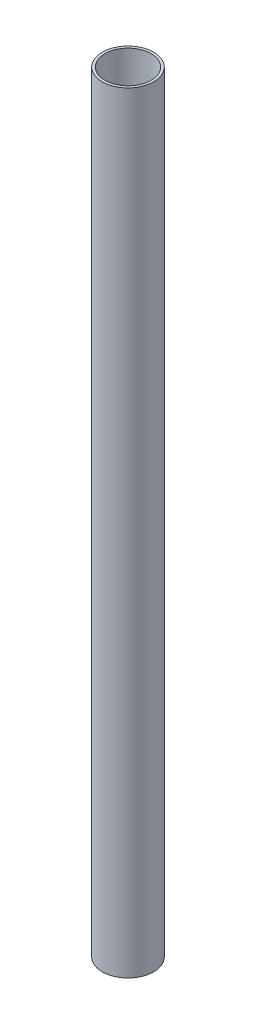
ISO-10303-21;
HEADER;
FILE_DESCRIPTION(('STEP AP214'),'2;1');
FILE_NAME('part.step','',(''),(''),'','','');
FILE_SCHEMA(('AUTOMOTIVE_DESIGN { 1 0 10303 214 1 1 1 1 }'));
ENDSEC;
DATA;
#1=APPLICATION_CONTEXT('core data for automotive mechanical design processes');
#2=APPLICATION_PROTOCOL_DEFINITION('international standard','automotive_design',2000,#1);
#3=PRODUCT_CONTEXT('',#1,'mechanical');
#4=PRODUCT('Part','Part','',(#3));
#5=PRODUCT_RELATED_PRODUCT_CATEGORY('part','',(#4));
#6=PRODUCT_DEFINITION_FORMATION('','',#4);
#7=PRODUCT_DEFINITION_CONTEXT('part definition',#1,'design');
#8=PRODUCT_DEFINITION('design','',#6,#7);
#9=PRODUCT_DEFINITION_SHAPE('','',#8);
#10=(LENGTH_UNIT() NAMED_UNIT(*) SI_UNIT(.MILLI.,.METRE.));
#11=(NAMED_UNIT(*) PLANE_ANGLE_UNIT() SI_UNIT($,.RADIAN.));
#12=(NAMED_UNIT(*) SI_UNIT($,.STERADIAN.) SOLID_ANGLE_UNIT());
#13=UNCERTAINTY_MEASURE_WITH_UNIT(LENGTH_MEASURE(1.E-05),#10,'distance_accuracy_value','');
#14=(GEOMETRIC_REPRESENTATION_CONTEXT(3) GLOBAL_UNCERTAINTY_ASSIGNED_CONTEXT((#13)) GLOBAL_UNIT_ASSIGNED_CONTEXT((#10,
#11,#12)) REPRESENTATION_CONTEXT('',''));
#15=CARTESIAN_POINT('',(0.,0.,0.));
#16=DIRECTION('',(0.,0.,1.));
#17=DIRECTION('',(1.,0.,0.));
#18=AXIS2_PLACEMENT_3D('',#15,#16,#17);
#19=CARTESIAN_POINT('',(0.,150.,0.));
#20=DIRECTION('',(0.,1.,0.));
#21=DIRECTION('',(0.,0.,1.));
#22=AXIS2_PLACEMENT_3D('',#19,#20,#21);
#23=PLANE('',#22);
#24=CARTESIAN_POINT('',(0.,150.,0.));
#25=DIRECTION('',(0.,1.,0.));
#26=DIRECTION('',(0.,0.,1.));
#27=AXIS2_PLACEMENT_3D('',#24,#25,#26);
#28=CIRCLE('',#27,10.);
#29=CARTESIAN_POINT('',(0.,150.,10.));
#30=VERTEX_POINT('',#29);
#31=EDGE_CURVE('E11',#30,#30,#28,.T.);
#32=ORIENTED_EDGE('',*,*,#31,.T.);
#33=EDGE_LOOP('',(#32));
#34=FACE_BOUND('',#33,.T.);
#35=CARTESIAN_POINT('',(0.,150.,0.));
#36=DIRECTION('',(0.,1.,0.));
#37=DIRECTION('',(1.,0.,0.));
#38=AXIS2_PLACEMENT_3D('',#35,#36,#37);
#39=CIRCLE('',#38,9.);
#40=CARTESIAN_POINT('',(9.,150.,0.));
#41=VERTEX_POINT('',#40);
#42=EDGE_CURVE('E48',#41,#41,#39,.T.);
#43=ORIENTED_EDGE('',*,*,#42,.F.);
#44=EDGE_LOOP('',(#43));
#45=FACE_BOUND('',#44,.T.);
#46=ADVANCED_FACE('F37',(#34,#45),#23,.T.);
#47=CARTESIAN_POINT('',(0.,-150.,0.));
#48=DIRECTION('',(0.,1.,0.));
#49=DIRECTION('',(0.,0.,1.));
#50=AXIS2_PLACEMENT_3D('',#47,#48,#49);
#51=PLANE('',#50);
#52=CARTESIAN_POINT('',(0.,-150.,0.));
#53=DIRECTION('',(0.,1.,0.));
#54=DIRECTION('',(0.,0.,1.));
#55=AXIS2_PLACEMENT_3D('',#52,#53,#54);
#56=CIRCLE('',#55,10.);
#57=CARTESIAN_POINT('',(0.,-150.,10.));
#58=VERTEX_POINT('',#57);
#59=EDGE_CURVE('E41',#58,#58,#56,.T.);
#60=ORIENTED_EDGE('',*,*,#59,.F.);
#61=EDGE_LOOP('',(#60));
#62=FACE_BOUND('',#61,.T.);
#63=CARTESIAN_POINT('',(0.,-150.,0.));
#64=DIRECTION('',(0.,1.,0.));
#65=DIRECTION('',(1.,0.,0.));
#66=AXIS2_PLACEMENT_3D('',#63,#64,#65);
#67=CIRCLE('',#66,9.);
#68=CARTESIAN_POINT('',(9.,-150.,0.));
#69=VERTEX_POINT('',#68);
#70=EDGE_CURVE('E50',#69,#69,#67,.T.);
#71=ORIENTED_EDGE('',*,*,#70,.T.);
#72=EDGE_LOOP('',(#71));
#73=FACE_BOUND('',#72,.T.);
#74=ADVANCED_FACE('F60',(#62,#73),#51,.F.);
#75=CARTESIAN_POINT('',(0.,150.,0.));
#76=DIRECTION('',(0.,-1.,0.));
#77=DIRECTION('',(0.,0.,-1.));
#78=AXIS2_PLACEMENT_3D('',#75,#76,#77);
#79=CYLINDRICAL_SURFACE('',#78,10.);
#80=ORIENTED_EDGE('',*,*,#31,.F.);
#81=EDGE_LOOP('',(#80));
#82=FACE_BOUND('',#81,.T.);
#83=ORIENTED_EDGE('',*,*,#59,.T.);
#84=EDGE_LOOP('',(#83));
#85=FACE_BOUND('',#84,.T.);
#86=ADVANCED_FACE('F39',(#82,#85),#79,.T.);
#87=CARTESIAN_POINT('',(0.,150.,0.));
#88=DIRECTION('',(0.,-1.,0.));
#89=DIRECTION('',(0.,0.,-1.));
#90=AXIS2_PLACEMENT_3D('',#87,#88,#89);
#91=CYLINDRICAL_SURFACE('',#90,9.);
#92=ORIENTED_EDGE('',*,*,#42,.T.);
#93=EDGE_LOOP('',(#92));
#94=FACE_BOUND('',#93,.T.);
#95=ORIENTED_EDGE('',*,*,#70,.F.);
#96=EDGE_LOOP('',(#95));
#97=FACE_BOUND('',#96,.T.);
#98=ADVANCED_FACE('F56',(#94,#97),#91,.F.);
#99=CLOSED_SHELL('',(#46,#74,#86,#98));
#100=MANIFOLD_SOLID_BREP('B2',#99);
#101=ADVANCED_BREP_SHAPE_REPRESENTATION('',(#18,#100),#14);
#102=SHAPE_DEFINITION_REPRESENTATION(#9,#101);
ENDSEC;
END-ISO-10303-21;
